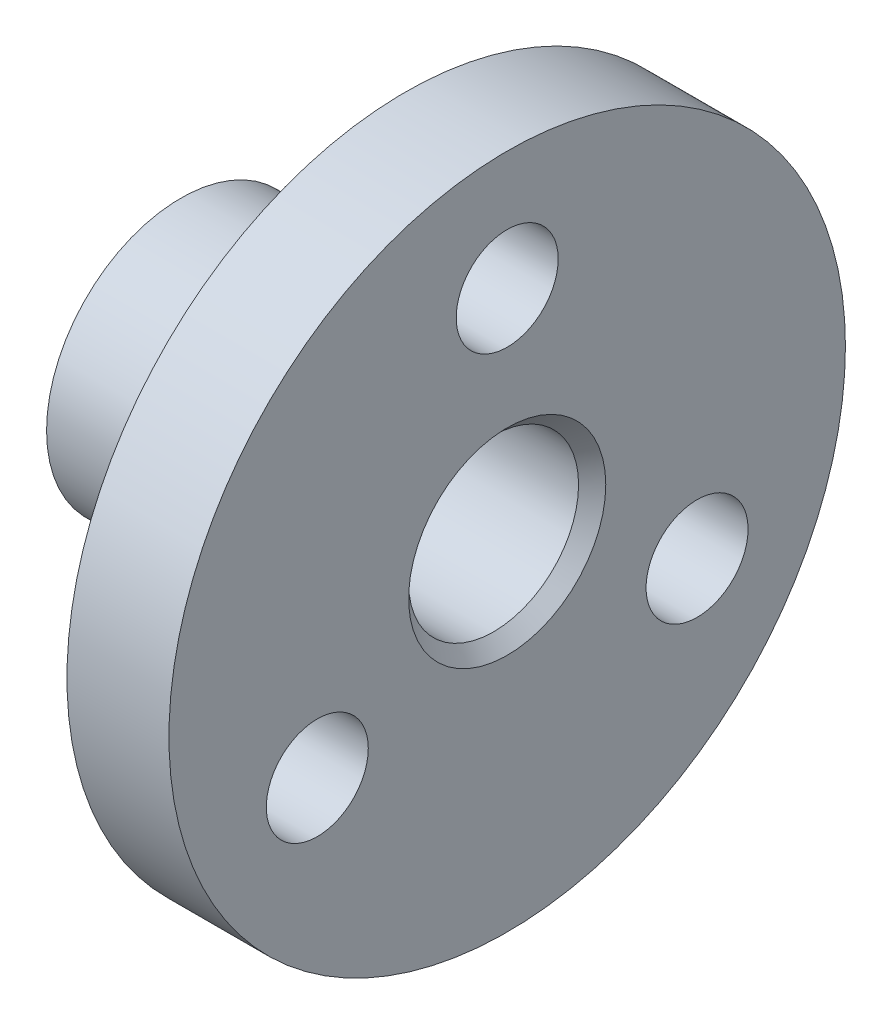
ISO-10303-21;
HEADER;
FILE_DESCRIPTION(('STEP AP214'),'2;1');
FILE_NAME('part.step','',(''),(''),'','','');
FILE_SCHEMA(('AUTOMOTIVE_DESIGN { 1 0 10303 214 1 1 1 1 }'));
ENDSEC;
DATA;
#1=APPLICATION_CONTEXT('core data for automotive mechanical design processes');
#2=APPLICATION_PROTOCOL_DEFINITION('international standard','automotive_design',2000,#1);
#3=PRODUCT_CONTEXT('',#1,'mechanical');
#4=PRODUCT('Part','Part','',(#3));
#5=PRODUCT_RELATED_PRODUCT_CATEGORY('part','',(#4));
#6=PRODUCT_DEFINITION_FORMATION('','',#4);
#7=PRODUCT_DEFINITION_CONTEXT('part definition',#1,'design');
#8=PRODUCT_DEFINITION('design','',#6,#7);
#9=PRODUCT_DEFINITION_SHAPE('','',#8);
#10=(LENGTH_UNIT() NAMED_UNIT(*) SI_UNIT(.MILLI.,.METRE.));
#11=(NAMED_UNIT(*) PLANE_ANGLE_UNIT() SI_UNIT($,.RADIAN.));
#12=(NAMED_UNIT(*) SI_UNIT($,.STERADIAN.) SOLID_ANGLE_UNIT());
#13=UNCERTAINTY_MEASURE_WITH_UNIT(LENGTH_MEASURE(1.E-05),#10,'distance_accuracy_value','');
#14=(GEOMETRIC_REPRESENTATION_CONTEXT(3) GLOBAL_UNCERTAINTY_ASSIGNED_CONTEXT((#13)) GLOBAL_UNIT_ASSIGNED_CONTEXT((#10,
#11,#12)) REPRESENTATION_CONTEXT('',''));
#15=CARTESIAN_POINT('',(0.,0.,0.));
#16=DIRECTION('',(0.,0.,1.));
#17=DIRECTION('',(1.,0.,0.));
#18=AXIS2_PLACEMENT_3D('',#15,#16,#17);
#19=CARTESIAN_POINT('',(3.,0.,0.));
#20=DIRECTION('',(1.,0.,0.));
#21=DIRECTION('',(0.,0.,-1.));
#22=AXIS2_PLACEMENT_3D('',#19,#20,#21);
#23=PLANE('',#22);
#24=CARTESIAN_POINT('',(3.,0.,0.));
#25=DIRECTION('',(1.,0.,0.));
#26=DIRECTION('',(0.,0.,-1.));
#27=AXIS2_PLACEMENT_3D('',#24,#25,#26);
#28=CIRCLE('',#27,2.9);
#29=CARTESIAN_POINT('',(3.,0.,-2.9));
#30=VERTEX_POINT('',#29);
#31=EDGE_CURVE('E55',#30,#30,#28,.F.);
#32=ORIENTED_EDGE('',*,*,#31,.T.);
#33=EDGE_LOOP('',(#32));
#34=FACE_BOUND('',#33,.T.);
#35=CARTESIAN_POINT('',(3.,-3.22499999999976,-5.58586385441004));
#36=DIRECTION('',(1.,0.,0.));
#37=DIRECTION('',(0.,0.,-1.));
#38=AXIS2_PLACEMENT_3D('',#35,#36,#37);
#39=CIRCLE('',#38,1.50000000000035);
#40=CARTESIAN_POINT('',(3.,-3.22499999999976,-7.0858638544104));
#41=VERTEX_POINT('',#40);
#42=EDGE_CURVE('E78',#41,#41,#39,.T.);
#43=ORIENTED_EDGE('',*,*,#42,.F.);
#44=EDGE_LOOP('',(#43));
#45=FACE_BOUND('',#44,.T.);
#46=CARTESIAN_POINT('',(3.,0.,0.));
#47=DIRECTION('',(1.,0.,0.));
#48=DIRECTION('',(0.,0.,-1.));
#49=AXIS2_PLACEMENT_3D('',#46,#47,#48);
#50=CIRCLE('',#49,9.95);
#51=CARTESIAN_POINT('',(3.,0.,-9.95));
#52=VERTEX_POINT('',#51);
#53=EDGE_CURVE('E65',#52,#52,#50,.T.);
#54=ORIENTED_EDGE('',*,*,#53,.T.);
#55=EDGE_LOOP('',(#54));
#56=FACE_BOUND('',#55,.T.);
#57=CARTESIAN_POINT('',(3.,6.45,0.));
#58=DIRECTION('',(1.,0.,0.));
#59=DIRECTION('',(0.,0.,-1.));
#60=AXIS2_PLACEMENT_3D('',#57,#58,#59);
#61=CIRCLE('',#60,1.5);
#62=CARTESIAN_POINT('',(3.,6.45,-1.5));
#63=VERTEX_POINT('',#62);
#64=EDGE_CURVE('E70',#63,#63,#61,.T.);
#65=ORIENTED_EDGE('',*,*,#64,.F.);
#66=EDGE_LOOP('',(#65));
#67=FACE_BOUND('',#66,.T.);
#68=CARTESIAN_POINT('',(3.,-3.22500000000024,5.58586385440922));
#69=DIRECTION('',(1.,0.,0.));
#70=DIRECTION('',(0.,0.,-1.));
#71=AXIS2_PLACEMENT_3D('',#68,#69,#70);
#72=CIRCLE('',#71,1.50000000000052);
#73=CARTESIAN_POINT('',(3.,-3.22500000000024,4.08586385440869));
#74=VERTEX_POINT('',#73);
#75=EDGE_CURVE('E86',#74,#74,#72,.T.);
#76=ORIENTED_EDGE('',*,*,#75,.F.);
#77=EDGE_LOOP('',(#76));
#78=FACE_BOUND('',#77,.T.);
#79=ADVANCED_FACE('F37',(#34,#45,#56,#67,#78),#23,.T.);
#80=CARTESIAN_POINT('',(0.,0.,0.));
#81=DIRECTION('',(1.,0.,0.));
#82=DIRECTION('',(0.,0.,-1.));
#83=AXIS2_PLACEMENT_3D('',#80,#81,#82);
#84=PLANE('',#83);
#85=CARTESIAN_POINT('',(0.,0.,0.));
#86=DIRECTION('',(1.,0.,0.));
#87=DIRECTION('',(0.,0.,-1.));
#88=AXIS2_PLACEMENT_3D('',#85,#86,#87);
#89=CIRCLE('',#88,3.95);
#90=CARTESIAN_POINT('',(0.,0.,-3.95));
#91=VERTEX_POINT('',#90);
#92=EDGE_CURVE('E61',#91,#91,#89,.F.);
#93=ORIENTED_EDGE('',*,*,#92,.F.);
#94=EDGE_LOOP('',(#93));
#95=FACE_BOUND('',#94,.T.);
#96=CARTESIAN_POINT('',(0.,0.,0.));
#97=DIRECTION('',(1.,0.,0.));
#98=DIRECTION('',(0.,0.,-1.));
#99=AXIS2_PLACEMENT_3D('',#96,#97,#98);
#100=CIRCLE('',#99,9.95);
#101=CARTESIAN_POINT('',(0.,0.,-9.95));
#102=VERTEX_POINT('',#101);
#103=EDGE_CURVE('E66',#102,#102,#100,.T.);
#104=ORIENTED_EDGE('',*,*,#103,.F.);
#105=EDGE_LOOP('',(#104));
#106=FACE_BOUND('',#105,.T.);
#107=CARTESIAN_POINT('',(0.,6.45,0.));
#108=DIRECTION('',(1.,0.,0.));
#109=DIRECTION('',(0.,0.,-1.));
#110=AXIS2_PLACEMENT_3D('',#107,#108,#109);
#111=CIRCLE('',#110,1.5);
#112=CARTESIAN_POINT('',(0.,6.45,-1.5));
#113=VERTEX_POINT('',#112);
#114=EDGE_CURVE('E74',#113,#113,#111,.T.);
#115=ORIENTED_EDGE('',*,*,#114,.T.);
#116=EDGE_LOOP('',(#115));
#117=FACE_BOUND('',#116,.T.);
#118=CARTESIAN_POINT('',(0.,-3.22499999999976,-5.58586385441004));
#119=DIRECTION('',(1.,0.,0.));
#120=DIRECTION('',(0.,0.,-1.));
#121=AXIS2_PLACEMENT_3D('',#118,#119,#120);
#122=CIRCLE('',#121,1.50000000000035);
#123=CARTESIAN_POINT('',(0.,-3.22499999999976,-7.0858638544104));
#124=VERTEX_POINT('',#123);
#125=EDGE_CURVE('E82',#124,#124,#122,.T.);
#126=ORIENTED_EDGE('',*,*,#125,.T.);
#127=EDGE_LOOP('',(#126));
#128=FACE_BOUND('',#127,.T.);
#129=CARTESIAN_POINT('',(0.,-3.22500000000024,5.58586385440922));
#130=DIRECTION('',(1.,0.,0.));
#131=DIRECTION('',(0.,0.,-1.));
#132=AXIS2_PLACEMENT_3D('',#129,#130,#131);
#133=CIRCLE('',#132,1.50000000000052);
#134=CARTESIAN_POINT('',(0.,-3.22500000000024,4.08586385440869));
#135=VERTEX_POINT('',#134);
#136=EDGE_CURVE('E90',#135,#135,#133,.T.);
#137=ORIENTED_EDGE('',*,*,#136,.T.);
#138=EDGE_LOOP('',(#137));
#139=FACE_BOUND('',#138,.T.);
#140=ADVANCED_FACE('F111',(#95,#106,#117,#128,#139),#84,.F.);
#141=CARTESIAN_POINT('',(3.,0.,0.));
#142=DIRECTION('',(-1.,0.,0.));
#143=DIRECTION('',(0.,0.,1.));
#144=AXIS2_PLACEMENT_3D('',#141,#142,#143);
#145=CYLINDRICAL_SURFACE('',#144,9.95);
#146=ORIENTED_EDGE('',*,*,#53,.F.);
#147=EDGE_LOOP('',(#146));
#148=FACE_BOUND('',#147,.T.);
#149=ORIENTED_EDGE('',*,*,#103,.T.);
#150=EDGE_LOOP('',(#149));
#151=FACE_BOUND('',#150,.T.);
#152=ADVANCED_FACE('F114',(#148,#151),#145,.T.);
#153=CARTESIAN_POINT('',(3.,6.45,0.));
#154=DIRECTION('',(-1.,0.,0.));
#155=DIRECTION('',(0.,0.,1.));
#156=AXIS2_PLACEMENT_3D('',#153,#154,#155);
#157=CYLINDRICAL_SURFACE('',#156,1.5);
#158=ORIENTED_EDGE('',*,*,#64,.T.);
#159=EDGE_LOOP('',(#158));
#160=FACE_BOUND('',#159,.T.);
#161=ORIENTED_EDGE('',*,*,#114,.F.);
#162=EDGE_LOOP('',(#161));
#163=FACE_BOUND('',#162,.T.);
#164=ADVANCED_FACE('F131',(#160,#163),#157,.F.);
#165=CARTESIAN_POINT('',(3.,-3.22499999999976,-5.58586385441004));
#166=DIRECTION('',(-1.,0.,0.));
#167=DIRECTION('',(0.,0.,1.));
#168=AXIS2_PLACEMENT_3D('',#165,#166,#167);
#169=CYLINDRICAL_SURFACE('',#168,1.50000000000035);
#170=ORIENTED_EDGE('',*,*,#42,.T.);
#171=EDGE_LOOP('',(#170));
#172=FACE_BOUND('',#171,.T.);
#173=ORIENTED_EDGE('',*,*,#125,.F.);
#174=EDGE_LOOP('',(#173));
#175=FACE_BOUND('',#174,.T.);
#176=ADVANCED_FACE('F125',(#172,#175),#169,.F.);
#177=CARTESIAN_POINT('',(3.,-3.22500000000024,5.58586385440922));
#178=DIRECTION('',(-1.,0.,0.));
#179=DIRECTION('',(0.,0.,1.));
#180=AXIS2_PLACEMENT_3D('',#177,#178,#179);
#181=CYLINDRICAL_SURFACE('',#180,1.50000000000052);
#182=ORIENTED_EDGE('',*,*,#75,.T.);
#183=EDGE_LOOP('',(#182));
#184=FACE_BOUND('',#183,.T.);
#185=ORIENTED_EDGE('',*,*,#136,.F.);
#186=EDGE_LOOP('',(#185));
#187=FACE_BOUND('',#186,.T.);
#188=ADVANCED_FACE('F107',(#184,#187),#181,.F.);
#189=CARTESIAN_POINT('',(-6.6,0.,0.));
#190=DIRECTION('',(1.,0.,0.));
#191=DIRECTION('',(0.,0.,-1.));
#192=AXIS2_PLACEMENT_3D('',#189,#190,#191);
#193=CYLINDRICAL_SURFACE('',#192,3.95);
#194=CARTESIAN_POINT('',(-6.6,0.,0.));
#195=DIRECTION('',(-1.,0.,0.));
#196=DIRECTION('',(0.,0.,1.));
#197=AXIS2_PLACEMENT_3D('',#194,#195,#196);
#198=CIRCLE('',#197,3.95);
#199=CARTESIAN_POINT('',(-6.6,0.,3.95));
#200=VERTEX_POINT('',#199);
#201=EDGE_CURVE('E94',#200,#200,#198,.T.);
#202=ORIENTED_EDGE('',*,*,#201,.F.);
#203=EDGE_LOOP('',(#202));
#204=FACE_BOUND('',#203,.T.);
#205=ORIENTED_EDGE('',*,*,#92,.T.);
#206=EDGE_LOOP('',(#205));
#207=FACE_BOUND('',#206,.T.);
#208=ADVANCED_FACE('F104',(#204,#207),#193,.T.);
#209=CARTESIAN_POINT('',(-6.6,0.,0.));
#210=DIRECTION('',(-1.,0.,0.));
#211=DIRECTION('',(0.,0.,1.));
#212=AXIS2_PLACEMENT_3D('',#209,#210,#211);
#213=PLANE('',#212);
#214=CARTESIAN_POINT('',(-6.6,0.,0.));
#215=DIRECTION('',(-1.,0.,0.));
#216=DIRECTION('',(0.,0.,1.));
#217=AXIS2_PLACEMENT_3D('',#214,#215,#216);
#218=CIRCLE('',#217,2.9);
#219=CARTESIAN_POINT('',(-6.6,0.,2.9));
#220=VERTEX_POINT('',#219);
#221=EDGE_CURVE('E10',#220,#220,#218,.F.);
#222=ORIENTED_EDGE('',*,*,#221,.T.);
#223=EDGE_LOOP('',(#222));
#224=FACE_BOUND('',#223,.T.);
#225=ORIENTED_EDGE('',*,*,#201,.T.);
#226=EDGE_LOOP('',(#225));
#227=FACE_BOUND('',#226,.T.);
#228=ADVANCED_FACE('F102',(#224,#227),#213,.T.);
#229=CARTESIAN_POINT('',(3.,0.,0.));
#230=DIRECTION('',(-1.,0.,0.));
#231=DIRECTION('',(0.,0.,1.));
#232=AXIS2_PLACEMENT_3D('',#229,#230,#231);
#233=CYLINDRICAL_SURFACE('',#232,2.5);
#234=CARTESIAN_POINT('',(2.6,0.,0.));
#235=DIRECTION('',(1.,0.,0.));
#236=DIRECTION('',(0.,0.,-1.));
#237=AXIS2_PLACEMENT_3D('',#234,#235,#236);
#238=CIRCLE('',#237,2.5);
#239=CARTESIAN_POINT('',(2.6,0.,2.5));
#240=VERTEX_POINT('',#239);
#241=EDGE_CURVE('E45',#240,#240,#238,.T.);
#242=CARTESIAN_POINT('',(-6.2,0.,0.));
#243=DIRECTION('',(-1.,0.,0.));
#244=DIRECTION('',(0.,0.,1.));
#245=AXIS2_PLACEMENT_3D('',#242,#243,#244);
#246=CIRCLE('',#245,2.5);
#247=CARTESIAN_POINT('',(-6.2,0.,2.5));
#248=VERTEX_POINT('',#247);
#249=EDGE_CURVE('E50',#248,#248,#246,.T.);
#250=CARTESIAN_POINT('',(2.6,0.,2.5));
#251=CARTESIAN_POINT('',(2.50833333333333,0.,2.5));
#252=CARTESIAN_POINT('',(2.41666666666667,0.,2.5));
#253=CARTESIAN_POINT('',(2.23333333333333,0.,2.5));
#254=CARTESIAN_POINT('',(2.14166666666667,0.,2.5));
#255=CARTESIAN_POINT('',(1.95833333333333,0.,2.5));
#256=CARTESIAN_POINT('',(1.86666666666667,0.,2.5));
#257=CARTESIAN_POINT('',(1.68333333333333,0.,2.5));
#258=CARTESIAN_POINT('',(1.59166666666667,0.,2.5));
#259=CARTESIAN_POINT('',(1.40833333333333,0.,2.5));
#260=CARTESIAN_POINT('',(1.31666666666667,0.,2.5));
#261=CARTESIAN_POINT('',(1.13333333333333,0.,2.5));
#262=CARTESIAN_POINT('',(1.04166666666667,0.,2.5));
#263=CARTESIAN_POINT('',(0.858333333333335,0.,2.5));
#264=CARTESIAN_POINT('',(0.766666666666668,0.,2.5));
#265=CARTESIAN_POINT('',(0.583333333333334,0.,2.5));
#266=CARTESIAN_POINT('',(0.491666666666668,0.,2.5));
#267=CARTESIAN_POINT('',(0.308333333333334,0.,2.5));
#268=CARTESIAN_POINT('',(0.216666666666668,0.,2.5));
#269=CARTESIAN_POINT('',(0.0333333333333343,0.,2.5));
#270=CARTESIAN_POINT('',(-0.0583333333333324,0.,2.5));
#271=CARTESIAN_POINT('',(-0.241666666666666,0.,2.5));
#272=CARTESIAN_POINT('',(-0.333333333333332,0.,2.5));
#273=CARTESIAN_POINT('',(-0.516666666666666,0.,2.5));
#274=CARTESIAN_POINT('',(-0.608333333333333,0.,2.5));
#275=CARTESIAN_POINT('',(-0.791666666666666,0.,2.5));
#276=CARTESIAN_POINT('',(-0.883333333333333,0.,2.5));
#277=CARTESIAN_POINT('',(-1.06666666666667,0.,2.5));
#278=CARTESIAN_POINT('',(-1.15833333333333,0.,2.5));
#279=CARTESIAN_POINT('',(-1.34166666666667,0.,2.5));
#280=CARTESIAN_POINT('',(-1.43333333333333,0.,2.5));
#281=CARTESIAN_POINT('',(-1.61666666666667,0.,2.5));
#282=CARTESIAN_POINT('',(-1.70833333333333,0.,2.5));
#283=CARTESIAN_POINT('',(-1.89166666666667,0.,2.5));
#284=CARTESIAN_POINT('',(-1.98333333333333,0.,2.5));
#285=CARTESIAN_POINT('',(-2.16666666666667,0.,2.5));
#286=CARTESIAN_POINT('',(-2.25833333333333,0.,2.5));
#287=CARTESIAN_POINT('',(-2.44166666666667,0.,2.5));
#288=CARTESIAN_POINT('',(-2.53333333333333,0.,2.5));
#289=CARTESIAN_POINT('',(-2.71666666666667,0.,2.5));
#290=CARTESIAN_POINT('',(-2.80833333333333,0.,2.5));
#291=CARTESIAN_POINT('',(-2.99166666666667,0.,2.5));
#292=CARTESIAN_POINT('',(-3.08333333333333,0.,2.5));
#293=CARTESIAN_POINT('',(-3.26666666666667,0.,2.5));
#294=CARTESIAN_POINT('',(-3.35833333333333,0.,2.5));
#295=CARTESIAN_POINT('',(-3.54166666666667,0.,2.5));
#296=CARTESIAN_POINT('',(-3.63333333333333,0.,2.5));
#297=CARTESIAN_POINT('',(-3.81666666666667,0.,2.5));
#298=CARTESIAN_POINT('',(-3.90833333333333,0.,2.5));
#299=CARTESIAN_POINT('',(-4.09166666666667,0.,2.5));
#300=CARTESIAN_POINT('',(-4.18333333333333,0.,2.5));
#301=CARTESIAN_POINT('',(-4.36666666666667,0.,2.5));
#302=CARTESIAN_POINT('',(-4.45833333333333,0.,2.5));
#303=CARTESIAN_POINT('',(-4.64166666666667,0.,2.5));
#304=CARTESIAN_POINT('',(-4.73333333333333,0.,2.5));
#305=CARTESIAN_POINT('',(-4.91666666666667,0.,2.5));
#306=CARTESIAN_POINT('',(-5.00833333333333,0.,2.5));
#307=CARTESIAN_POINT('',(-5.19166666666667,0.,2.5));
#308=CARTESIAN_POINT('',(-5.28333333333333,0.,2.5));
#309=CARTESIAN_POINT('',(-5.46666666666667,0.,2.5));
#310=CARTESIAN_POINT('',(-5.55833333333333,0.,2.5));
#311=CARTESIAN_POINT('',(-5.74166666666667,0.,2.5));
#312=CARTESIAN_POINT('',(-5.83333333333333,0.,2.5));
#313=CARTESIAN_POINT('',(-6.01666666666667,0.,2.5));
#314=CARTESIAN_POINT('',(-6.10833333333333,0.,2.5));
#315=CARTESIAN_POINT('',(-6.2,0.,2.5));
#316=B_SPLINE_CURVE_WITH_KNOTS('',3,(#250,#251,#252,#253,#254,#255,#256,#257,#258,#259,#260,
#261,#262,#263,#264,#265,#266,#267,#268,#269,#270,#271,#272,#273,#274,#275,#276,#277,#278,#279,
#280,#281,#282,#283,#284,#285,#286,#287,#288,#289,#290,#291,#292,#293,#294,#295,#296,#297,#298,
#299,#300,#301,#302,#303,#304,#305,#306,#307,#308,#309,#310,#311,#312,#313,#314,#315),
.UNSPECIFIED.,.F.,.F.,(4,2,2,2,2,2,2,2,2,2,2,2,2,2,2,2,2,2,2,2,2,2,2,2,2,2,2,2,2,2,2,2,4),(0.,
0.275,0.55,0.825,1.1,1.375,1.65,1.925,2.2,2.475,2.75,3.025,3.3,3.575,3.85,4.125,4.4,4.675,4.95,
5.225,5.5,5.775,6.05,6.325,6.6,6.875,7.15,7.425,7.7,7.975,8.25,8.525,8.8),.UNSPECIFIED.);
#317=EDGE_CURVE('BSEAM146',#240,#248,#316,.T.);
#318=ORIENTED_EDGE('',*,*,#241,.T.);
#319=ORIENTED_EDGE('',*,*,#249,.T.);
#320=ORIENTED_EDGE('',*,*,#317,.T.);
#321=ORIENTED_EDGE('',*,*,#317,.F.);
#322=EDGE_LOOP('',(#318,#320,#319,#321));
#323=FACE_BOUND('',#322,.T.);
#324=ADVANCED_FACE('F146',(#323),#233,.F.);
#325=CARTESIAN_POINT('',(3.,0.,0.));
#326=DIRECTION('',(1.,0.,0.));
#327=DIRECTION('',(0.,0.,-1.));
#328=AXIS2_PLACEMENT_3D('',#325,#326,#327);
#329=CONICAL_SURFACE('',#328,2.9,0.785398163397445);
#330=ORIENTED_EDGE('',*,*,#241,.F.);
#331=EDGE_LOOP('',(#330));
#332=FACE_BOUND('',#331,.T.);
#333=ORIENTED_EDGE('',*,*,#31,.F.);
#334=EDGE_LOOP('',(#333));
#335=FACE_BOUND('',#334,.T.);
#336=ADVANCED_FACE('F144',(#332,#335),#329,.F.);
#337=CARTESIAN_POINT('',(-6.2,0.,0.));
#338=DIRECTION('',(-1.,0.,0.));
#339=DIRECTION('',(0.,0.,1.));
#340=AXIS2_PLACEMENT_3D('',#337,#338,#339);
#341=CONICAL_SURFACE('',#340,2.5,0.785398163397453);
#342=CARTESIAN_POINT('',(-6.6,0.,2.9));
#343=CARTESIAN_POINT('',(-6.59583333333333,0.,2.89583333333334));
#344=CARTESIAN_POINT('',(-6.59166666666667,0.,2.89166666666667));
#345=CARTESIAN_POINT('',(-6.58333333333333,0.,2.88333333333334));
#346=CARTESIAN_POINT('',(-6.57916666666667,0.,2.87916666666667));
#347=CARTESIAN_POINT('',(-6.57083333333333,0.,2.87083333333334));
#348=CARTESIAN_POINT('',(-6.56666666666667,0.,2.86666666666667));
#349=CARTESIAN_POINT('',(-6.55833333333333,0.,2.85833333333334));
#350=CARTESIAN_POINT('',(-6.55416666666667,0.,2.85416666666667));
#351=CARTESIAN_POINT('',(-6.54583333333333,0.,2.84583333333334));
#352=CARTESIAN_POINT('',(-6.54166666666667,0.,2.84166666666667));
#353=CARTESIAN_POINT('',(-6.53333333333333,0.,2.83333333333334));
#354=CARTESIAN_POINT('',(-6.52916666666667,0.,2.82916666666667));
#355=CARTESIAN_POINT('',(-6.52083333333333,0.,2.82083333333334));
#356=CARTESIAN_POINT('',(-6.51666666666667,0.,2.81666666666667));
#357=CARTESIAN_POINT('',(-6.50833333333333,0.,2.80833333333334));
#358=CARTESIAN_POINT('',(-6.50416666666667,0.,2.80416666666667));
#359=CARTESIAN_POINT('',(-6.49583333333333,0.,2.79583333333334));
#360=CARTESIAN_POINT('',(-6.49166666666667,0.,2.79166666666667));
#361=CARTESIAN_POINT('',(-6.48333333333333,0.,2.78333333333333));
#362=CARTESIAN_POINT('',(-6.47916666666667,0.,2.77916666666667));
#363=CARTESIAN_POINT('',(-6.47083333333333,0.,2.77083333333334));
#364=CARTESIAN_POINT('',(-6.46666666666667,0.,2.76666666666667));
#365=CARTESIAN_POINT('',(-6.45833333333333,0.,2.75833333333334));
#366=CARTESIAN_POINT('',(-6.45416666666667,0.,2.75416666666667));
#367=CARTESIAN_POINT('',(-6.44583333333333,0.,2.74583333333333));
#368=CARTESIAN_POINT('',(-6.44166666666667,0.,2.74166666666667));
#369=CARTESIAN_POINT('',(-6.43333333333333,0.,2.73333333333334));
#370=CARTESIAN_POINT('',(-6.42916666666667,0.,2.72916666666667));
#371=CARTESIAN_POINT('',(-6.42083333333333,0.,2.72083333333333));
#372=CARTESIAN_POINT('',(-6.41666666666667,0.,2.71666666666667));
#373=CARTESIAN_POINT('',(-6.40833333333333,0.,2.70833333333333));
#374=CARTESIAN_POINT('',(-6.40416666666667,0.,2.70416666666667));
#375=CARTESIAN_POINT('',(-6.39583333333333,0.,2.69583333333333));
#376=CARTESIAN_POINT('',(-6.39166666666667,0.,2.69166666666667));
#377=CARTESIAN_POINT('',(-6.38333333333333,0.,2.68333333333333));
#378=CARTESIAN_POINT('',(-6.37916666666667,0.,2.67916666666667));
#379=CARTESIAN_POINT('',(-6.37083333333333,0.,2.67083333333333));
#380=CARTESIAN_POINT('',(-6.36666666666667,0.,2.66666666666667));
#381=CARTESIAN_POINT('',(-6.35833333333333,0.,2.65833333333333));
#382=CARTESIAN_POINT('',(-6.35416666666667,0.,2.65416666666667));
#383=CARTESIAN_POINT('',(-6.34583333333333,0.,2.64583333333333));
#384=CARTESIAN_POINT('',(-6.34166666666667,0.,2.64166666666667));
#385=CARTESIAN_POINT('',(-6.33333333333333,0.,2.63333333333333));
#386=CARTESIAN_POINT('',(-6.32916666666667,0.,2.62916666666667));
#387=CARTESIAN_POINT('',(-6.32083333333333,0.,2.62083333333333));
#388=CARTESIAN_POINT('',(-6.31666666666667,0.,2.61666666666667));
#389=CARTESIAN_POINT('',(-6.30833333333333,0.,2.60833333333333));
#390=CARTESIAN_POINT('',(-6.30416666666667,0.,2.60416666666667));
#391=CARTESIAN_POINT('',(-6.29583333333333,0.,2.59583333333333));
#392=CARTESIAN_POINT('',(-6.29166666666667,0.,2.59166666666667));
#393=CARTESIAN_POINT('',(-6.28333333333333,0.,2.58333333333333));
#394=CARTESIAN_POINT('',(-6.27916666666667,0.,2.57916666666667));
#395=CARTESIAN_POINT('',(-6.27083333333333,0.,2.57083333333333));
#396=CARTESIAN_POINT('',(-6.26666666666667,0.,2.56666666666667));
#397=CARTESIAN_POINT('',(-6.25833333333333,0.,2.55833333333333));
#398=CARTESIAN_POINT('',(-6.25416666666667,0.,2.55416666666667));
#399=CARTESIAN_POINT('',(-6.24583333333333,0.,2.54583333333333));
#400=CARTESIAN_POINT('',(-6.24166666666667,0.,2.54166666666667));
#401=CARTESIAN_POINT('',(-6.23333333333333,0.,2.53333333333333));
#402=CARTESIAN_POINT('',(-6.22916666666667,0.,2.52916666666667));
#403=CARTESIAN_POINT('',(-6.22083333333333,0.,2.52083333333333));
#404=CARTESIAN_POINT('',(-6.21666666666667,0.,2.51666666666667));
#405=CARTESIAN_POINT('',(-6.20833333333333,0.,2.50833333333333));
#406=CARTESIAN_POINT('',(-6.20416666666667,0.,2.50416666666667));
#407=CARTESIAN_POINT('',(-6.2,0.,2.5));
#408=B_SPLINE_CURVE_WITH_KNOTS('',3,(#342,#343,#344,#345,#346,#347,#348,#349,#350,#351,#352,
#353,#354,#355,#356,#357,#358,#359,#360,#361,#362,#363,#364,#365,#366,#367,#368,#369,#370,#371,
#372,#373,#374,#375,#376,#377,#378,#379,#380,#381,#382,#383,#384,#385,#386,#387,#388,#389,#390,
#391,#392,#393,#394,#395,#396,#397,#398,#399,#400,#401,#402,#403,#404,#405,#406,#407),
.UNSPECIFIED.,.F.,.F.,(4,2,2,2,2,2,2,2,2,2,2,2,2,2,2,2,2,2,2,2,2,2,2,2,2,2,2,2,2,2,2,2,4),(0.,
0.0176776695296633,0.0353553390593275,0.0530330085889907,0.0707106781186549,0.0883883476483182,
0.106066017177982,0.123743686707646,0.14142135623731,0.159099025766974,0.176776695296637,
0.194454364826301,0.212132034355965,0.229809703885628,0.247487373415292,0.265165042944956,
0.28284271247462,0.300520382004283,0.318198051533947,0.335875721063611,0.353553390593275,
0.371231060122938,0.388908729652602,0.406586399182265,0.42426406871193,0.441941738241594,
0.459619407771257,0.477297077300921,0.494974746830584,0.512652416360248,0.530330085889912,
0.548007755419576,0.565685424949239),.UNSPECIFIED.);
#409=EDGE_CURVE('BSEAM39',#220,#248,#408,.T.);
#410=ORIENTED_EDGE('',*,*,#221,.F.);
#411=ORIENTED_EDGE('',*,*,#249,.F.);
#412=ORIENTED_EDGE('',*,*,#409,.T.);
#413=ORIENTED_EDGE('',*,*,#409,.F.);
#414=EDGE_LOOP('',(#410,#412,#411,#413));
#415=FACE_BOUND('',#414,.T.);
#416=ADVANCED_FACE('F39',(#415),#341,.F.);
#417=CLOSED_SHELL('',(#79,#140,#152,#164,#176,#188,#208,#228,#324,#336,#416));
#418=MANIFOLD_SOLID_BREP('B2',#417);
#419=ADVANCED_BREP_SHAPE_REPRESENTATION('',(#18,#418),#14);
#420=SHAPE_DEFINITION_REPRESENTATION(#9,#419);
ENDSEC;
END-ISO-10303-21;
